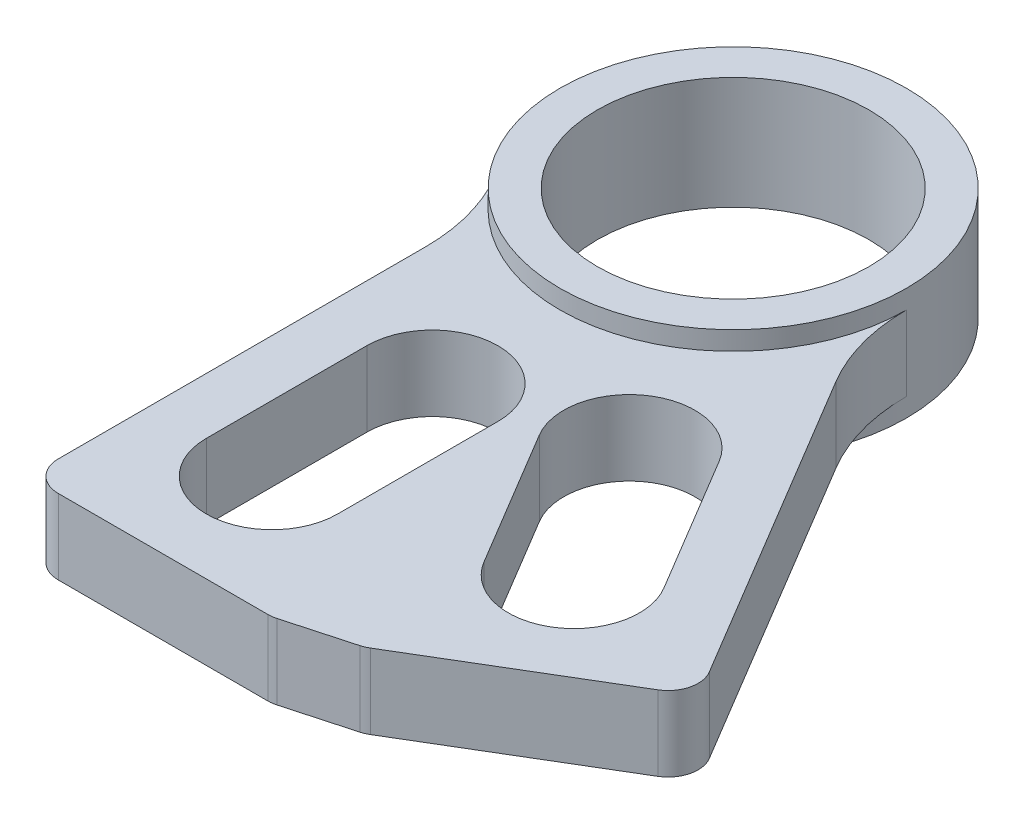
ISO-10303-21;
HEADER;
FILE_DESCRIPTION(('STEP AP214'),'2;1');
FILE_NAME('part.step','',(''),(''),'','','');
FILE_SCHEMA(('AUTOMOTIVE_DESIGN { 1 0 10303 214 1 1 1 1 }'));
ENDSEC;
DATA;
#1=APPLICATION_CONTEXT('core data for automotive mechanical design processes');
#2=APPLICATION_PROTOCOL_DEFINITION('international standard','automotive_design',2000,#1);
#3=PRODUCT_CONTEXT('',#1,'mechanical');
#4=PRODUCT('Part','Part','',(#3));
#5=PRODUCT_RELATED_PRODUCT_CATEGORY('part','',(#4));
#6=PRODUCT_DEFINITION_FORMATION('','',#4);
#7=PRODUCT_DEFINITION_CONTEXT('part definition',#1,'design');
#8=PRODUCT_DEFINITION('design','',#6,#7);
#9=PRODUCT_DEFINITION_SHAPE('','',#8);
#10=(LENGTH_UNIT() NAMED_UNIT(*) SI_UNIT(.MILLI.,.METRE.));
#11=(NAMED_UNIT(*) PLANE_ANGLE_UNIT() SI_UNIT($,.RADIAN.));
#12=(NAMED_UNIT(*) SI_UNIT($,.STERADIAN.) SOLID_ANGLE_UNIT());
#13=UNCERTAINTY_MEASURE_WITH_UNIT(LENGTH_MEASURE(1.E-05),#10,'distance_accuracy_value','');
#14=(GEOMETRIC_REPRESENTATION_CONTEXT(3) GLOBAL_UNCERTAINTY_ASSIGNED_CONTEXT((#13)) GLOBAL_UNIT_ASSIGNED_CONTEXT((#10,
#11,#12)) REPRESENTATION_CONTEXT('',''));
#15=CARTESIAN_POINT('',(0.,0.,0.));
#16=DIRECTION('',(0.,0.,1.));
#17=DIRECTION('',(1.,0.,0.));
#18=AXIS2_PLACEMENT_3D('',#15,#16,#17);
#19=CARTESIAN_POINT('',(0.,4.7625,0.));
#20=DIRECTION('',(0.,-1.,0.));
#21=DIRECTION('',(0.,0.,-1.));
#22=AXIS2_PLACEMENT_3D('',#19,#20,#21);
#23=CYLINDRICAL_SURFACE('',#22,11.5062);
#24=CARTESIAN_POINT('',(0.,4.7625,0.));
#25=DIRECTION('',(0.,1.,0.));
#26=DIRECTION('',(0.,0.,1.));
#27=AXIS2_PLACEMENT_3D('',#24,#25,#26);
#28=CIRCLE('',#27,11.5062);
#29=CARTESIAN_POINT('',(0.,4.7625,-11.5062));
#30=VERTEX_POINT('',#29);
#31=EDGE_CURVE('E285',#30,#30,#28,.T.);
#32=CARTESIAN_POINT('',(0.,-4.7625,0.));
#33=DIRECTION('',(0.,1.,0.));
#34=DIRECTION('',(0.,0.,1.));
#35=AXIS2_PLACEMENT_3D('',#32,#33,#34);
#36=CIRCLE('',#35,11.5062);
#37=CARTESIAN_POINT('',(0.,-4.7625,-11.5062));
#38=VERTEX_POINT('',#37);
#39=EDGE_CURVE('E280',#38,#38,#36,.T.);
#40=CARTESIAN_POINT('',(0.,4.7625,-11.5062));
#41=CARTESIAN_POINT('',(0.,4.66328125,-11.5062));
#42=CARTESIAN_POINT('',(0.,4.5640625,-11.5062));
#43=CARTESIAN_POINT('',(0.,4.365625,-11.5062));
#44=CARTESIAN_POINT('',(0.,4.26640625,-11.5062));
#45=CARTESIAN_POINT('',(0.,4.06796875,-11.5062));
#46=CARTESIAN_POINT('',(0.,3.96875,-11.5062));
#47=CARTESIAN_POINT('',(0.,3.7703125,-11.5062));
#48=CARTESIAN_POINT('',(0.,3.67109375,-11.5062));
#49=CARTESIAN_POINT('',(0.,3.47265625,-11.5062));
#50=CARTESIAN_POINT('',(0.,3.3734375,-11.5062));
#51=CARTESIAN_POINT('',(0.,3.175,-11.5062));
#52=CARTESIAN_POINT('',(0.,3.07578125,-11.5062));
#53=CARTESIAN_POINT('',(0.,2.87734375,-11.5062));
#54=CARTESIAN_POINT('',(0.,2.778125,-11.5062));
#55=CARTESIAN_POINT('',(0.,2.5796875,-11.5062));
#56=CARTESIAN_POINT('',(0.,2.48046875,-11.5062));
#57=CARTESIAN_POINT('',(0.,2.28203125,-11.5062));
#58=CARTESIAN_POINT('',(0.,2.1828125,-11.5062));
#59=CARTESIAN_POINT('',(0.,1.984375,-11.5062));
#60=CARTESIAN_POINT('',(0.,1.88515625,-11.5062));
#61=CARTESIAN_POINT('',(0.,1.68671875,-11.5062));
#62=CARTESIAN_POINT('',(0.,1.5875,-11.5062));
#63=CARTESIAN_POINT('',(0.,1.3890625,-11.5062));
#64=CARTESIAN_POINT('',(0.,1.28984375,-11.5062));
#65=CARTESIAN_POINT('',(0.,1.09140625,-11.5062));
#66=CARTESIAN_POINT('',(0.,0.992187499999999,-11.5062));
#67=CARTESIAN_POINT('',(0.,0.79375,-11.5062));
#68=CARTESIAN_POINT('',(0.,0.69453125,-11.5062));
#69=CARTESIAN_POINT('',(0.,0.49609375,-11.5062));
#70=CARTESIAN_POINT('',(0.,0.396875,-11.5062));
#71=CARTESIAN_POINT('',(0.,0.1984375,-11.5062));
#72=CARTESIAN_POINT('',(0.,0.0992187500000001,-11.5062));
#73=CARTESIAN_POINT('',(0.,-0.0992187500000001,-11.5062));
#74=CARTESIAN_POINT('',(0.,-0.1984375,-11.5062));
#75=CARTESIAN_POINT('',(0.,-0.396875,-11.5062));
#76=CARTESIAN_POINT('',(0.,-0.49609375,-11.5062));
#77=CARTESIAN_POINT('',(0.,-0.69453125,-11.5062));
#78=CARTESIAN_POINT('',(0.,-0.793750000000001,-11.5062));
#79=CARTESIAN_POINT('',(0.,-0.992187500000001,-11.5062));
#80=CARTESIAN_POINT('',(0.,-1.09140625,-11.5062));
#81=CARTESIAN_POINT('',(0.,-1.28984375,-11.5062));
#82=CARTESIAN_POINT('',(0.,-1.3890625,-11.5062));
#83=CARTESIAN_POINT('',(0.,-1.5875,-11.5062));
#84=CARTESIAN_POINT('',(0.,-1.68671875,-11.5062));
#85=CARTESIAN_POINT('',(0.,-1.88515625,-11.5062));
#86=CARTESIAN_POINT('',(0.,-1.984375,-11.5062));
#87=CARTESIAN_POINT('',(0.,-2.1828125,-11.5062));
#88=CARTESIAN_POINT('',(0.,-2.28203125,-11.5062));
#89=CARTESIAN_POINT('',(0.,-2.48046875,-11.5062));
#90=CARTESIAN_POINT('',(0.,-2.5796875,-11.5062));
#91=CARTESIAN_POINT('',(0.,-2.778125,-11.5062));
#92=CARTESIAN_POINT('',(0.,-2.87734375,-11.5062));
#93=CARTESIAN_POINT('',(0.,-3.07578125,-11.5062));
#94=CARTESIAN_POINT('',(0.,-3.175,-11.5062));
#95=CARTESIAN_POINT('',(0.,-3.3734375,-11.5062));
#96=CARTESIAN_POINT('',(0.,-3.47265625,-11.5062));
#97=CARTESIAN_POINT('',(0.,-3.67109375,-11.5062));
#98=CARTESIAN_POINT('',(0.,-3.7703125,-11.5062));
#99=CARTESIAN_POINT('',(0.,-3.96875,-11.5062));
#100=CARTESIAN_POINT('',(0.,-4.06796875,-11.5062));
#101=CARTESIAN_POINT('',(0.,-4.26640625,-11.5062));
#102=CARTESIAN_POINT('',(0.,-4.365625,-11.5062));
#103=CARTESIAN_POINT('',(0.,-4.5640625,-11.5062));
#104=CARTESIAN_POINT('',(0.,-4.66328125,-11.5062));
#105=CARTESIAN_POINT('',(0.,-4.7625,-11.5062));
#106=B_SPLINE_CURVE_WITH_KNOTS('',3,(#40,#41,#42,#43,#44,#45,#46,#47,#48,#49,#50,#51,#52,#53,
#54,#55,#56,#57,#58,#59,#60,#61,#62,#63,#64,#65,#66,#67,#68,#69,#70,#71,#72,#73,#74,#75,#76,#77,
#78,#79,#80,#81,#82,#83,#84,#85,#86,#87,#88,#89,#90,#91,#92,#93,#94,#95,#96,#97,#98,#99,#100,
#101,#102,#103,#104,#105),.UNSPECIFIED.,.F.,.F.,(4,2,2,2,2,2,2,2,2,2,2,2,2,2,2,2,2,2,2,2,2,2,2,
2,2,2,2,2,2,2,2,2,4),(0.,0.29765625,0.5953125,0.892968750000001,1.190625,1.48828125,1.7859375,
2.08359375,2.38125,2.67890625,2.9765625,3.27421875,3.571875,3.86953125,4.1671875,4.46484375,
4.7625,5.06015625,5.3578125,5.65546875,5.953125,6.25078125,6.5484375,6.84609375,7.14375,
7.44140625,7.7390625,8.03671875,8.334375,8.63203125,8.9296875,9.22734375,9.525),.UNSPECIFIED.);
#107=EDGE_CURVE('BSEAM43',#30,#38,#106,.T.);
#108=ORIENTED_EDGE('',*,*,#31,.T.);
#109=ORIENTED_EDGE('',*,*,#39,.F.);
#110=ORIENTED_EDGE('',*,*,#107,.T.);
#111=ORIENTED_EDGE('',*,*,#107,.F.);
#112=EDGE_LOOP('',(#108,#110,#109,#111));
#113=FACE_BOUND('',#112,.T.);
#114=ADVANCED_FACE('F43',(#113),#23,.F.);
#115=CARTESIAN_POINT('',(0.,4.7625,0.));
#116=DIRECTION('',(0.,-1.,0.));
#117=DIRECTION('',(0.,0.,-1.));
#118=AXIS2_PLACEMENT_3D('',#115,#116,#117);
#119=CYLINDRICAL_SURFACE('',#118,14.6812);
#120=DIRECTION('',(0.,-1.,0.));
#121=VECTOR('',#120,1.);
#122=CARTESIAN_POINT('',(14.6811919059461,4.7625,0.015416250636803));
#123=LINE('',#122,#121);
#124=CARTESIAN_POINT('',(14.6811919059461,3.175,0.015416250636803));
#125=VERTEX_POINT('',#124);
#126=CARTESIAN_POINT('',(14.6811919059461,-3.175,0.015416250636803));
#127=VERTEX_POINT('',#126);
#128=EDGE_CURVE('E299',#125,#127,#123,.T.);
#129=ORIENTED_EDGE('',*,*,#128,.T.);
#130=CARTESIAN_POINT('',(0.,-3.175,0.));
#131=DIRECTION('',(0.,1.,0.));
#132=DIRECTION('',(0.,0.,1.));
#133=AXIS2_PLACEMENT_3D('',#130,#131,#132);
#134=CIRCLE('',#133,14.6812);
#135=CARTESIAN_POINT('',(-12.5938687913907,-3.175,7.54533646070437));
#136=VERTEX_POINT('',#135);
#137=EDGE_CURVE('E260',#136,#127,#134,.T.);
#138=ORIENTED_EDGE('',*,*,#137,.F.);
#139=DIRECTION('',(0.,-1.,0.));
#140=VECTOR('',#139,1.);
#141=CARTESIAN_POINT('',(-12.5938687913907,4.7625,7.54533646070436));
#142=LINE('',#141,#140);
#143=CARTESIAN_POINT('',(-12.5938687913907,3.175,7.54533646070437));
#144=VERTEX_POINT('',#143);
#145=EDGE_CURVE('E292',#136,#144,#142,.F.);
#146=ORIENTED_EDGE('',*,*,#145,.T.);
#147=CARTESIAN_POINT('',(0.,3.175,0.));
#148=DIRECTION('',(0.,1.,0.));
#149=DIRECTION('',(0.,0.,1.));
#150=AXIS2_PLACEMENT_3D('',#147,#148,#149);
#151=CIRCLE('',#150,14.6812);
#152=EDGE_CURVE('E224',#144,#125,#151,.T.);
#153=ORIENTED_EDGE('',*,*,#152,.T.);
#154=EDGE_LOOP('',(#129,#138,#146,#153));
#155=FACE_BOUND('',#154,.T.);
#156=CARTESIAN_POINT('',(0.,4.7625,0.));
#157=DIRECTION('',(0.,1.,0.));
#158=DIRECTION('',(0.,0.,1.));
#159=AXIS2_PLACEMENT_3D('',#156,#157,#158);
#160=CIRCLE('',#159,14.6812);
#161=CARTESIAN_POINT('',(0.,4.7625,14.6812));
#162=VERTEX_POINT('',#161);
#163=EDGE_CURVE('E288',#162,#162,#160,.T.);
#164=ORIENTED_EDGE('',*,*,#163,.F.);
#165=EDGE_LOOP('',(#164));
#166=FACE_BOUND('',#165,.T.);
#167=CARTESIAN_POINT('',(0.,-4.7625,0.));
#168=DIRECTION('',(0.,1.,0.));
#169=DIRECTION('',(0.,0.,1.));
#170=AXIS2_PLACEMENT_3D('',#167,#168,#169);
#171=CIRCLE('',#170,14.6812);
#172=CARTESIAN_POINT('',(0.,-4.7625,14.6812));
#173=VERTEX_POINT('',#172);
#174=EDGE_CURVE('E289',#173,#173,#171,.T.);
#175=ORIENTED_EDGE('',*,*,#174,.T.);
#176=EDGE_LOOP('',(#175));
#177=FACE_BOUND('',#176,.T.);
#178=ADVANCED_FACE('F377',(#155,#166,#177),#119,.T.);
#179=CARTESIAN_POINT('',(0.,4.7625,0.));
#180=DIRECTION('',(0.,1.,0.));
#181=DIRECTION('',(0.,0.,1.));
#182=AXIS2_PLACEMENT_3D('',#179,#180,#181);
#183=PLANE('',#182);
#184=ORIENTED_EDGE('',*,*,#31,.F.);
#185=EDGE_LOOP('',(#184));
#186=FACE_BOUND('',#185,.T.);
#187=ORIENTED_EDGE('',*,*,#163,.T.);
#188=EDGE_LOOP('',(#187));
#189=FACE_BOUND('',#188,.T.);
#190=ADVANCED_FACE('F411',(#186,#189),#183,.T.);
#191=CARTESIAN_POINT('',(0.,-4.7625,0.));
#192=DIRECTION('',(0.,1.,0.));
#193=DIRECTION('',(0.,0.,1.));
#194=AXIS2_PLACEMENT_3D('',#191,#192,#193);
#195=PLANE('',#194);
#196=ORIENTED_EDGE('',*,*,#39,.T.);
#197=EDGE_LOOP('',(#196));
#198=FACE_BOUND('',#197,.T.);
#199=ORIENTED_EDGE('',*,*,#174,.F.);
#200=EDGE_LOOP('',(#199));
#201=FACE_BOUND('',#200,.T.);
#202=ADVANCED_FACE('F573',(#198,#201),#195,.F.);
#203=CARTESIAN_POINT('',(-10.31875,3.175,0.));
#204=DIRECTION('',(-1.,0.,0.));
#205=DIRECTION('',(0.,0.,1.));
#206=AXIS2_PLACEMENT_3D('',#203,#204,#205);
#207=PLANE('',#206);
#208=DIRECTION('',(0.,0.,-1.));
#209=VECTOR('',#208,1.);
#210=CARTESIAN_POINT('',(-10.31875,-3.175,0.));
#211=LINE('',#210,#209);
#212=CARTESIAN_POINT('',(-10.31875,-3.175,46.8503));
#213=VERTEX_POINT('',#212);
#214=CARTESIAN_POINT('',(-10.31875,-3.175,15.7694921185655));
#215=VERTEX_POINT('',#214);
#216=EDGE_CURVE('E262',#213,#215,#211,.T.);
#217=ORIENTED_EDGE('',*,*,#216,.F.);
#218=DIRECTION('',(0.,-1.,0.));
#219=VECTOR('',#218,1.);
#220=CARTESIAN_POINT('',(-10.31875,3.175,46.8503));
#221=LINE('',#220,#219);
#222=CARTESIAN_POINT('',(-10.31875,3.175,46.8503));
#223=VERTEX_POINT('',#222);
#224=EDGE_CURVE('E333',#213,#223,#221,.F.);
#225=ORIENTED_EDGE('',*,*,#224,.T.);
#226=DIRECTION('',(0.,0.,-1.));
#227=VECTOR('',#226,1.);
#228=CARTESIAN_POINT('',(-10.31875,3.175,0.));
#229=LINE('',#228,#227);
#230=CARTESIAN_POINT('',(-10.31875,3.175,15.7694921185655));
#231=VERTEX_POINT('',#230);
#232=EDGE_CURVE('E226',#223,#231,#229,.T.);
#233=ORIENTED_EDGE('',*,*,#232,.T.);
#234=DIRECTION('',(0.,-1.,0.));
#235=VECTOR('',#234,1.);
#236=CARTESIAN_POINT('',(-10.31875,3.175,15.7694921185655));
#237=LINE('',#236,#235);
#238=EDGE_CURVE('E305',#231,#215,#237,.T.);
#239=ORIENTED_EDGE('',*,*,#238,.T.);
#240=EDGE_LOOP('',(#217,#225,#233,#239));
#241=FACE_BOUND('',#240,.T.);
#242=ADVANCED_FACE('F565',(#241),#207,.T.);
#243=CARTESIAN_POINT('',(0.,3.175,49.3903));
#244=DIRECTION('',(0.,0.,-1.));
#245=DIRECTION('',(-1.,0.,0.));
#246=AXIS2_PLACEMENT_3D('',#243,#244,#245);
#247=PLANE('',#246);
#248=DIRECTION('',(1.,0.,0.));
#249=VECTOR('',#248,1.);
#250=CARTESIAN_POINT('',(0.,3.175,49.3903));
#251=LINE('',#250,#249);
#252=CARTESIAN_POINT('',(-7.77874999999999,3.175,49.3903));
#253=VERTEX_POINT('',#252);
#254=CARTESIAN_POINT('',(9.97457427537823,3.175,49.3903));
#255=VERTEX_POINT('',#254);
#256=EDGE_CURVE('E228',#253,#255,#251,.T.);
#257=ORIENTED_EDGE('',*,*,#256,.F.);
#258=DIRECTION('',(0.,-1.,0.));
#259=VECTOR('',#258,1.);
#260=CARTESIAN_POINT('',(-7.77874999999999,-3.175,49.3903));
#261=LINE('',#260,#259);
#262=CARTESIAN_POINT('',(-7.77874999999999,-3.175,49.3903));
#263=VERTEX_POINT('',#262);
#264=EDGE_CURVE('E322',#253,#263,#261,.T.);
#265=ORIENTED_EDGE('',*,*,#264,.T.);
#266=DIRECTION('',(1.,0.,0.));
#267=VECTOR('',#266,1.);
#268=CARTESIAN_POINT('',(0.,-3.175,49.3903));
#269=LINE('',#268,#267);
#270=CARTESIAN_POINT('',(9.97457427537823,-3.175,49.3903));
#271=VERTEX_POINT('',#270);
#272=EDGE_CURVE('E264',#263,#271,#269,.T.);
#273=ORIENTED_EDGE('',*,*,#272,.T.);
#274=DIRECTION('',(0.,-1.,0.));
#275=VECTOR('',#274,1.);
#276=CARTESIAN_POINT('',(9.97457427537823,3.175,49.3903));
#277=LINE('',#276,#275);
#278=EDGE_CURVE('E320',#271,#255,#277,.F.);
#279=ORIENTED_EDGE('',*,*,#278,.T.);
#280=EDGE_LOOP('',(#257,#265,#273,#279));
#281=FACE_BOUND('',#280,.T.);
#282=ADVANCED_FACE('F393',(#281),#247,.F.);
#283=CARTESIAN_POINT('',(13.4004724476745,3.175,48.5395182401329));
#284=DIRECTION('',(-0.266118345679753,0.,-0.96394036438603));
#285=DIRECTION('',(-0.96394036438603,0.,0.266118345679753));
#286=AXIS2_PLACEMENT_3D('',#283,#284,#285);
#287=PLANE('',#286);
#288=DIRECTION('',(0.96394036438603,0.,-0.266118345679753));
#289=VECTOR('',#288,1.);
#290=CARTESIAN_POINT('',(13.4004724476745,-3.175,48.5395182401329));
#291=LINE('',#290,#289);
#292=CARTESIAN_POINT('',(10.6505148734048,-3.175,49.2987085255405));
#293=VERTEX_POINT('',#292);
#294=CARTESIAN_POINT('',(16.1504300219459,-3.175,47.7803279547248));
#295=VERTEX_POINT('',#294);
#296=EDGE_CURVE('E267',#293,#295,#291,.T.);
#297=ORIENTED_EDGE('',*,*,#296,.T.);
#298=DIRECTION('',(0.,-1.,0.));
#299=VECTOR('',#298,1.);
#300=CARTESIAN_POINT('',(16.1504300219459,3.175,47.7803279547248));
#301=LINE('',#300,#299);
#302=CARTESIAN_POINT('',(16.1504300219459,3.175,47.7803279547248));
#303=VERTEX_POINT('',#302);
#304=EDGE_CURVE('E51',#295,#303,#301,.F.);
#305=ORIENTED_EDGE('',*,*,#304,.T.);
#306=DIRECTION('',(0.96394036438603,0.,-0.266118345679753));
#307=VECTOR('',#306,1.);
#308=CARTESIAN_POINT('',(13.4004724476745,3.175,48.5395182401329));
#309=LINE('',#308,#307);
#310=CARTESIAN_POINT('',(10.6505148734048,3.175,49.2987085255405));
#311=VERTEX_POINT('',#310);
#312=EDGE_CURVE('E231',#311,#303,#309,.T.);
#313=ORIENTED_EDGE('',*,*,#312,.F.);
#314=DIRECTION('',(0.,-1.,0.));
#315=VECTOR('',#314,1.);
#316=CARTESIAN_POINT('',(10.6505148734048,3.175,49.2987085255405));
#317=LINE('',#316,#315);
#318=EDGE_CURVE('E346',#311,#293,#317,.T.);
#319=ORIENTED_EDGE('',*,*,#318,.T.);
#320=EDGE_LOOP('',(#297,#305,#313,#319));
#321=FACE_BOUND('',#320,.T.);
#322=ADVANCED_FACE('F351',(#321),#287,.F.);
#323=CARTESIAN_POINT('',(25.3394183213385,3.175,42.3947592660486));
#324=DIRECTION('',(-0.513044430208735,0.,-0.85836205218532));
#325=DIRECTION('',(-0.85836205218532,0.,0.513044430208735));
#326=AXIS2_PLACEMENT_3D('',#323,#324,#325);
#327=PLANE('',#326);
#328=DIRECTION('',(0.85836205218532,0.,-0.513044430208735));
#329=VECTOR('',#328,1.);
#330=CARTESIAN_POINT('',(25.3394183213385,3.175,42.3947592660486));
#331=LINE('',#330,#329);
#332=CARTESIAN_POINT('',(16.7776222766495,3.175,47.512159041735));
#333=VERTEX_POINT('',#332);
#334=CARTESIAN_POINT('',(32.0164021347746,3.175,38.4039149045627));
#335=VERTEX_POINT('',#334);
#336=EDGE_CURVE('E234',#333,#335,#331,.T.);
#337=ORIENTED_EDGE('',*,*,#336,.F.);
#338=DIRECTION('',(0.,-1.,0.));
#339=VECTOR('',#338,1.);
#340=CARTESIAN_POINT('',(16.7776222766495,3.175,47.512159041735));
#341=LINE('',#340,#339);
#342=CARTESIAN_POINT('',(16.7776222766495,-3.175,47.512159041735));
#343=VERTEX_POINT('',#342);
#344=EDGE_CURVE('E343',#333,#343,#341,.T.);
#345=ORIENTED_EDGE('',*,*,#344,.T.);
#346=DIRECTION('',(0.85836205218532,0.,-0.513044430208735));
#347=VECTOR('',#346,1.);
#348=CARTESIAN_POINT('',(25.3394183213385,-3.175,42.3947592660486));
#349=LINE('',#348,#347);
#350=CARTESIAN_POINT('',(32.0164021347746,-3.175,38.4039149045627));
#351=VERTEX_POINT('',#350);
#352=EDGE_CURVE('E270',#343,#351,#349,.T.);
#353=ORIENTED_EDGE('',*,*,#352,.T.);
#354=DIRECTION('',(0.,-1.,0.));
#355=VECTOR('',#354,1.);
#356=CARTESIAN_POINT('',(32.0164021347746,3.175,38.4039149045627));
#357=LINE('',#356,#355);
#358=EDGE_CURVE('E66',#351,#335,#357,.F.);
#359=ORIENTED_EDGE('',*,*,#358,.T.);
#360=EDGE_LOOP('',(#337,#345,#353,#359));
#361=FACE_BOUND('',#360,.T.);
#362=ADVANCED_FACE('F361',(#361),#327,.F.);
#363=CARTESIAN_POINT('',(0.,3.175,25.48255));
#364=DIRECTION('',(0.,-1.,0.));
#365=DIRECTION('',(0.,0.,-1.));
#366=AXIS2_PLACEMENT_3D('',#363,#364,#365);
#367=CYLINDRICAL_SURFACE('',#366,5.55625);
#368=CARTESIAN_POINT('',(0.,-3.175,25.48255));
#369=DIRECTION('',(0.,1.,0.));
#370=DIRECTION('',(0.,0.,1.));
#371=AXIS2_PLACEMENT_3D('',#368,#369,#370);
#372=CIRCLE('',#371,5.55625);
#373=CARTESIAN_POINT('',(5.55625,-3.175,25.48255));
#374=VERTEX_POINT('',#373);
#375=CARTESIAN_POINT('',(-5.55624999999999,-3.175,25.48255));
#376=VERTEX_POINT('',#375);
#377=EDGE_CURVE('E248',#374,#376,#372,.T.);
#378=ORIENTED_EDGE('',*,*,#377,.F.);
#379=DIRECTION('',(0.,-1.,0.));
#380=VECTOR('',#379,1.);
#381=CARTESIAN_POINT('',(5.55625,3.175,25.48255));
#382=LINE('',#381,#380);
#383=CARTESIAN_POINT('',(5.55625,3.175,25.48255));
#384=VERTEX_POINT('',#383);
#385=EDGE_CURVE('E278',#384,#374,#382,.T.);
#386=ORIENTED_EDGE('',*,*,#385,.F.);
#387=CARTESIAN_POINT('',(0.,3.175,25.48255));
#388=DIRECTION('',(0.,1.,0.));
#389=DIRECTION('',(0.,0.,1.));
#390=AXIS2_PLACEMENT_3D('',#387,#388,#389);
#391=CIRCLE('',#390,5.55625);
#392=CARTESIAN_POINT('',(-5.55624999999999,3.175,25.48255));
#393=VERTEX_POINT('',#392);
#394=EDGE_CURVE('E213',#384,#393,#391,.T.);
#395=ORIENTED_EDGE('',*,*,#394,.T.);
#396=DIRECTION('',(0.,-1.,0.));
#397=VECTOR('',#396,1.);
#398=CARTESIAN_POINT('',(-5.55624999999999,3.175,25.48255));
#399=LINE('',#398,#397);
#400=EDGE_CURVE('E192',#393,#376,#399,.T.);
#401=ORIENTED_EDGE('',*,*,#400,.T.);
#402=EDGE_LOOP('',(#378,#386,#395,#401));
#403=FACE_BOUND('',#402,.T.);
#404=ADVANCED_FACE('F534',(#403),#367,.F.);
#405=CARTESIAN_POINT('',(5.55625,3.175,0.));
#406=DIRECTION('',(-1.,0.,0.));
#407=DIRECTION('',(0.,0.,1.));
#408=AXIS2_PLACEMENT_3D('',#405,#406,#407);
#409=PLANE('',#408);
#410=DIRECTION('',(0.,0.,-1.));
#411=VECTOR('',#410,1.);
#412=CARTESIAN_POINT('',(5.55625,-3.175,0.));
#413=LINE('',#412,#411);
#414=CARTESIAN_POINT('',(5.55625,-3.175,39.07155));
#415=VERTEX_POINT('',#414);
#416=EDGE_CURVE('E251',#415,#374,#413,.T.);
#417=ORIENTED_EDGE('',*,*,#416,.F.);
#418=DIRECTION('',(0.,-1.,0.));
#419=VECTOR('',#418,1.);
#420=CARTESIAN_POINT('',(5.55625,3.175,39.07155));
#421=LINE('',#420,#419);
#422=CARTESIAN_POINT('',(5.55625,3.175,39.07155));
#423=VERTEX_POINT('',#422);
#424=EDGE_CURVE('E276',#423,#415,#421,.T.);
#425=ORIENTED_EDGE('',*,*,#424,.F.);
#426=DIRECTION('',(0.,0.,-1.));
#427=VECTOR('',#426,1.);
#428=CARTESIAN_POINT('',(5.55625,3.175,0.));
#429=LINE('',#428,#427);
#430=EDGE_CURVE('E216',#423,#384,#429,.T.);
#431=ORIENTED_EDGE('',*,*,#430,.T.);
#432=ORIENTED_EDGE('',*,*,#385,.T.);
#433=EDGE_LOOP('',(#417,#425,#431,#432));
#434=FACE_BOUND('',#433,.T.);
#435=ADVANCED_FACE('F525',(#434),#409,.T.);
#436=CARTESIAN_POINT('',(0.,3.175,39.07155));
#437=DIRECTION('',(0.,-1.,0.));
#438=DIRECTION('',(0.,0.,-1.));
#439=AXIS2_PLACEMENT_3D('',#436,#437,#438);
#440=CYLINDRICAL_SURFACE('',#439,5.55625);
#441=CARTESIAN_POINT('',(0.,-3.175,39.07155));
#442=DIRECTION('',(0.,1.,0.));
#443=DIRECTION('',(0.,0.,1.));
#444=AXIS2_PLACEMENT_3D('',#441,#442,#443);
#445=CIRCLE('',#444,5.55625);
#446=CARTESIAN_POINT('',(-5.55625,-3.175,39.07155));
#447=VERTEX_POINT('',#446);
#448=EDGE_CURVE('E254',#447,#415,#445,.T.);
#449=ORIENTED_EDGE('',*,*,#448,.F.);
#450=DIRECTION('',(0.,-1.,0.));
#451=VECTOR('',#450,1.);
#452=CARTESIAN_POINT('',(-5.55625,3.175,39.07155));
#453=LINE('',#452,#451);
#454=CARTESIAN_POINT('',(-5.55625,3.175,39.07155));
#455=VERTEX_POINT('',#454);
#456=EDGE_CURVE('E274',#455,#447,#453,.T.);
#457=ORIENTED_EDGE('',*,*,#456,.F.);
#458=CARTESIAN_POINT('',(0.,3.175,39.07155));
#459=DIRECTION('',(0.,1.,0.));
#460=DIRECTION('',(0.,0.,1.));
#461=AXIS2_PLACEMENT_3D('',#458,#459,#460);
#462=CIRCLE('',#461,5.55625);
#463=EDGE_CURVE('E219',#455,#423,#462,.T.);
#464=ORIENTED_EDGE('',*,*,#463,.T.);
#465=ORIENTED_EDGE('',*,*,#424,.T.);
#466=EDGE_LOOP('',(#449,#457,#464,#465));
#467=FACE_BOUND('',#466,.T.);
#468=ADVANCED_FACE('F517',(#467),#440,.F.);
#469=CARTESIAN_POINT('',(13.0736803450151,3.175,21.8732539129153));
#470=DIRECTION('',(0.,-1.,0.));
#471=DIRECTION('',(0.,0.,-1.));
#472=AXIS2_PLACEMENT_3D('',#469,#470,#471);
#473=CYLINDRICAL_SURFACE('',#472,5.55625);
#474=CARTESIAN_POINT('',(13.0736803450151,-3.175,21.8732539129153));
#475=DIRECTION('',(0.,1.,0.));
#476=DIRECTION('',(0.,0.,1.));
#477=AXIS2_PLACEMENT_3D('',#474,#475,#476);
#478=CIRCLE('',#477,5.55625);
#479=CARTESIAN_POINT('',(17.8429544974698,-3.175,19.022650797568));
#480=VERTEX_POINT('',#479);
#481=CARTESIAN_POINT('',(8.30440619256044,-3.175,24.7238570282626));
#482=VERTEX_POINT('',#481);
#483=EDGE_CURVE('E187',#480,#482,#478,.T.);
#484=ORIENTED_EDGE('',*,*,#483,.F.);
#485=DIRECTION('',(0.,-1.,0.));
#486=VECTOR('',#485,1.);
#487=CARTESIAN_POINT('',(17.8429544974698,3.175,19.022650797568));
#488=LINE('',#487,#486);
#489=CARTESIAN_POINT('',(17.8429544974698,3.175,19.022650797568));
#490=VERTEX_POINT('',#489);
#491=EDGE_CURVE('E182',#490,#480,#488,.T.);
#492=ORIENTED_EDGE('',*,*,#491,.F.);
#493=CARTESIAN_POINT('',(13.0736803450151,3.175,21.8732539129153));
#494=DIRECTION('',(0.,1.,0.));
#495=DIRECTION('',(0.,0.,1.));
#496=AXIS2_PLACEMENT_3D('',#493,#494,#495);
#497=CIRCLE('',#496,5.55625);
#498=CARTESIAN_POINT('',(8.30440619256044,3.175,24.7238570282626));
#499=VERTEX_POINT('',#498);
#500=EDGE_CURVE('E185',#490,#499,#497,.T.);
#501=ORIENTED_EDGE('',*,*,#500,.T.);
#502=DIRECTION('',(0.,-1.,0.));
#503=VECTOR('',#502,1.);
#504=CARTESIAN_POINT('',(8.30440619256044,3.175,24.7238570282626));
#505=LINE('',#504,#503);
#506=EDGE_CURVE('E238',#499,#482,#505,.T.);
#507=ORIENTED_EDGE('',*,*,#506,.T.);
#508=EDGE_LOOP('',(#484,#492,#501,#507));
#509=FACE_BOUND('',#508,.T.);
#510=ADVANCED_FACE('F184',(#509),#473,.F.);
#511=CARTESIAN_POINT('',(4.76927415245425,3.175,-2.85060311534702));
#512=DIRECTION('',(-0.858362052185321,0.,0.513044430208734));
#513=DIRECTION('',(0.513044430208734,0.,0.858362052185321));
#514=AXIS2_PLACEMENT_3D('',#511,#512,#513);
#515=PLANE('',#514);
#516=DIRECTION('',(-0.513044430208734,0.,-0.858362052185321));
#517=VECTOR('',#516,1.);
#518=CARTESIAN_POINT('',(4.76927415245425,-3.175,-2.85060311534702));
#519=LINE('',#518,#517);
#520=CARTESIAN_POINT('',(24.8147152595763,-3.175,30.6869327247143));
#521=VERTEX_POINT('',#520);
#522=EDGE_CURVE('E240',#521,#480,#519,.T.);
#523=ORIENTED_EDGE('',*,*,#522,.F.);
#524=DIRECTION('',(0.,-1.,0.));
#525=VECTOR('',#524,1.);
#526=CARTESIAN_POINT('',(24.8147152595763,3.175,30.6869327247143));
#527=LINE('',#526,#525);
#528=CARTESIAN_POINT('',(24.8147152595763,3.175,30.6869327247143));
#529=VERTEX_POINT('',#528);
#530=EDGE_CURVE('E193',#529,#521,#527,.T.);
#531=ORIENTED_EDGE('',*,*,#530,.F.);
#532=DIRECTION('',(-0.513044430208734,0.,-0.858362052185321));
#533=VECTOR('',#532,1.);
#534=CARTESIAN_POINT('',(4.76927415245425,3.175,-2.85060311534702));
#535=LINE('',#534,#533);
#536=EDGE_CURVE('E200',#529,#490,#535,.T.);
#537=ORIENTED_EDGE('',*,*,#536,.T.);
#538=ORIENTED_EDGE('',*,*,#491,.T.);
#539=EDGE_LOOP('',(#523,#531,#537,#538));
#540=FACE_BOUND('',#539,.T.);
#541=ADVANCED_FACE('F207',(#540),#515,.T.);
#542=CARTESIAN_POINT('',(20.0454411071216,3.175,33.5375358400616));
#543=DIRECTION('',(0.,-1.,0.));
#544=DIRECTION('',(0.,0.,-1.));
#545=AXIS2_PLACEMENT_3D('',#542,#543,#544);
#546=CYLINDRICAL_SURFACE('',#545,5.55624999999999);
#547=CARTESIAN_POINT('',(20.0454411071216,-3.175,33.5375358400616));
#548=DIRECTION('',(0.,1.,0.));
#549=DIRECTION('',(0.,0.,1.));
#550=AXIS2_PLACEMENT_3D('',#547,#548,#549);
#551=CIRCLE('',#550,5.55624999999999);
#552=CARTESIAN_POINT('',(15.2761669546669,-3.175,36.3881389554089));
#553=VERTEX_POINT('',#552);
#554=EDGE_CURVE('E242',#553,#521,#551,.T.);
#555=ORIENTED_EDGE('',*,*,#554,.F.);
#556=DIRECTION('',(0.,-1.,0.));
#557=VECTOR('',#556,1.);
#558=CARTESIAN_POINT('',(15.2761669546669,3.175,36.3881389554089));
#559=LINE('',#558,#557);
#560=CARTESIAN_POINT('',(15.2761669546669,3.175,36.3881389554089));
#561=VERTEX_POINT('',#560);
#562=EDGE_CURVE('E282',#561,#553,#559,.T.);
#563=ORIENTED_EDGE('',*,*,#562,.F.);
#564=CARTESIAN_POINT('',(20.0454411071216,3.175,33.5375358400616));
#565=DIRECTION('',(0.,1.,0.));
#566=DIRECTION('',(0.,0.,1.));
#567=AXIS2_PLACEMENT_3D('',#564,#565,#566);
#568=CIRCLE('',#567,5.55624999999999);
#569=EDGE_CURVE('E208',#561,#529,#568,.T.);
#570=ORIENTED_EDGE('',*,*,#569,.T.);
#571=ORIENTED_EDGE('',*,*,#530,.T.);
#572=EDGE_LOOP('',(#555,#563,#570,#571));
#573=FACE_BOUND('',#572,.T.);
#574=ADVANCED_FACE('F493',(#573),#546,.F.);
#575=CARTESIAN_POINT('',(-5.55624999999999,3.175,0.));
#576=DIRECTION('',(-1.,0.,0.));
#577=DIRECTION('',(0.,0.,1.));
#578=AXIS2_PLACEMENT_3D('',#575,#576,#577);
#579=PLANE('',#578);
#580=DIRECTION('',(0.,0.,-1.));
#581=VECTOR('',#580,1.);
#582=CARTESIAN_POINT('',(-5.55624999999999,-3.175,0.));
#583=LINE('',#582,#581);
#584=EDGE_CURVE('E257',#447,#376,#583,.T.);
#585=ORIENTED_EDGE('',*,*,#584,.T.);
#586=ORIENTED_EDGE('',*,*,#400,.F.);
#587=DIRECTION('',(0.,0.,-1.));
#588=VECTOR('',#587,1.);
#589=CARTESIAN_POINT('',(-5.55624999999999,3.175,0.));
#590=LINE('',#589,#588);
#591=EDGE_CURVE('E222',#455,#393,#590,.T.);
#592=ORIENTED_EDGE('',*,*,#591,.F.);
#593=ORIENTED_EDGE('',*,*,#456,.T.);
#594=EDGE_LOOP('',(#585,#586,#592,#593));
#595=FACE_BOUND('',#594,.T.);
#596=ADVANCED_FACE('F484',(#595),#579,.F.);
#597=CARTESIAN_POINT('',(-4.76927415245515,3.175,2.85060311534756));
#598=DIRECTION('',(-0.85836205218532,0.,0.513044430208735));
#599=DIRECTION('',(0.513044430208735,0.,0.85836205218532));
#600=AXIS2_PLACEMENT_3D('',#597,#598,#599);
#601=PLANE('',#600);
#602=DIRECTION('',(-0.513044430208735,0.,-0.85836205218532));
#603=VECTOR('',#602,1.);
#604=CARTESIAN_POINT('',(-4.76927415245515,-3.175,2.85060311534756));
#605=LINE('',#604,#603);
#606=EDGE_CURVE('E245',#553,#482,#605,.T.);
#607=ORIENTED_EDGE('',*,*,#606,.T.);
#608=ORIENTED_EDGE('',*,*,#506,.F.);
#609=DIRECTION('',(-0.513044430208735,0.,-0.85836205218532));
#610=VECTOR('',#609,1.);
#611=CARTESIAN_POINT('',(-4.76927415245515,3.175,2.85060311534756));
#612=LINE('',#611,#610);
#613=EDGE_CURVE('E203',#561,#499,#612,.T.);
#614=ORIENTED_EDGE('',*,*,#613,.F.);
#615=ORIENTED_EDGE('',*,*,#562,.T.);
#616=EDGE_LOOP('',(#607,#608,#614,#615));
#617=FACE_BOUND('',#616,.T.);
#618=ADVANCED_FACE('F476',(#617),#601,.F.);
#619=CARTESIAN_POINT('',(8.85722342598682,3.175,-5.29397721421611));
#620=DIRECTION('',(-0.85836205218532,0.,0.513044430208734));
#621=DIRECTION('',(0.513044430208735,0.,0.858362052185321));
#622=AXIS2_PLACEMENT_3D('',#619,#620,#621);
#623=PLANE('',#622);
#624=DIRECTION('',(-0.513044430208735,0.,-0.858362052185321));
#625=VECTOR('',#624,1.);
#626=CARTESIAN_POINT('',(8.85722342598682,3.175,-5.29397721421611));
#627=LINE('',#626,#625);
#628=CARTESIAN_POINT('',(32.8935088945951,3.175,34.9205424392818));
#629=VERTEX_POINT('',#628);
#630=CARTESIAN_POINT('',(16.9476735246379,3.175,8.24195640259681));
#631=VERTEX_POINT('',#630);
#632=EDGE_CURVE('E236',#629,#631,#627,.T.);
#633=ORIENTED_EDGE('',*,*,#632,.F.);
#634=DIRECTION('',(0.,-1.,0.));
#635=VECTOR('',#634,1.);
#636=CARTESIAN_POINT('',(32.8935088945951,3.175,34.9205424392818));
#637=LINE('',#636,#635);
#638=CARTESIAN_POINT('',(32.8935088945951,-3.175,34.9205424392818));
#639=VERTEX_POINT('',#638);
#640=EDGE_CURVE('E11',#629,#639,#637,.T.);
#641=ORIENTED_EDGE('',*,*,#640,.T.);
#642=DIRECTION('',(-0.513044430208735,0.,-0.858362052185321));
#643=VECTOR('',#642,1.);
#644=CARTESIAN_POINT('',(8.85722342598682,-3.175,-5.29397721421611));
#645=LINE('',#644,#643);
#646=CARTESIAN_POINT('',(16.9476735246379,-3.175,8.24195640259681));
#647=VERTEX_POINT('',#646);
#648=EDGE_CURVE('E205',#639,#647,#645,.T.);
#649=ORIENTED_EDGE('',*,*,#648,.T.);
#650=DIRECTION('',(0.,1.,0.));
#651=VECTOR('',#650,1.);
#652=CARTESIAN_POINT('',(16.9476735246379,3.175,8.2419564025968));
#653=LINE('',#652,#651);
#654=EDGE_CURVE('E302',#647,#631,#653,.T.);
#655=ORIENTED_EDGE('',*,*,#654,.T.);
#656=EDGE_LOOP('',(#633,#641,#649,#655));
#657=FACE_BOUND('',#656,.T.);
#658=ADVANCED_FACE('F369',(#657),#623,.F.);
#659=CARTESIAN_POINT('',(0.,3.175,0.));
#660=DIRECTION('',(0.,1.,0.));
#661=DIRECTION('',(0.,0.,1.));
#662=AXIS2_PLACEMENT_3D('',#659,#660,#661);
#663=PLANE('',#662);
#664=ORIENTED_EDGE('',*,*,#500,.F.);
#665=ORIENTED_EDGE('',*,*,#536,.F.);
#666=ORIENTED_EDGE('',*,*,#569,.F.);
#667=ORIENTED_EDGE('',*,*,#613,.T.);
#668=EDGE_LOOP('',(#664,#665,#666,#667));
#669=FACE_BOUND('',#668,.T.);
#670=ORIENTED_EDGE('',*,*,#394,.F.);
#671=ORIENTED_EDGE('',*,*,#430,.F.);
#672=ORIENTED_EDGE('',*,*,#463,.F.);
#673=ORIENTED_EDGE('',*,*,#591,.T.);
#674=EDGE_LOOP('',(#670,#671,#672,#673));
#675=FACE_BOUND('',#674,.T.);
#676=ORIENTED_EDGE('',*,*,#232,.F.);
#677=CARTESIAN_POINT('',(-7.77874999999999,3.175,46.8503));
#678=DIRECTION('',(0.,1.,0.));
#679=DIRECTION('',(0.,0.,1.));
#680=AXIS2_PLACEMENT_3D('',#677,#678,#679);
#681=CIRCLE('',#680,2.54);
#682=EDGE_CURVE('E340',#223,#253,#681,.T.);
#683=ORIENTED_EDGE('',*,*,#682,.T.);
#684=ORIENTED_EDGE('',*,*,#256,.T.);
#685=CARTESIAN_POINT('',(9.97457427537823,3.175,46.8503));
#686=DIRECTION('',(0.,1.,0.));
#687=DIRECTION('',(0.,0.,1.));
#688=AXIS2_PLACEMENT_3D('',#685,#686,#687);
#689=CIRCLE('',#688,2.54);
#690=EDGE_CURVE('E336',#255,#311,#689,.T.);
#691=ORIENTED_EDGE('',*,*,#690,.T.);
#692=ORIENTED_EDGE('',*,*,#312,.T.);
#693=CARTESIAN_POINT('',(15.4744894239193,3.175,45.3319194291843));
#694=DIRECTION('',(0.,1.,0.));
#695=DIRECTION('',(0.,0.,1.));
#696=AXIS2_PLACEMENT_3D('',#693,#694,#695);
#697=CIRCLE('',#696,2.54);
#698=EDGE_CURVE('E338',#303,#333,#697,.T.);
#699=ORIENTED_EDGE('',*,*,#698,.T.);
#700=ORIENTED_EDGE('',*,*,#336,.T.);
#701=CARTESIAN_POINT('',(30.7132692820444,3.175,36.223675292012));
#702=DIRECTION('',(0.,1.,0.));
#703=DIRECTION('',(0.,0.,1.));
#704=AXIS2_PLACEMENT_3D('',#701,#702,#703);
#705=CIRCLE('',#704,2.54);
#706=EDGE_CURVE('E58',#335,#629,#705,.T.);
#707=ORIENTED_EDGE('',*,*,#706,.T.);
#708=ORIENTED_EDGE('',*,*,#632,.T.);
#709=CARTESIAN_POINT('',(30.6831830837073,3.175,0.0322194303966402));
#710=DIRECTION('',(0.,1.,0.));
#711=DIRECTION('',(0.,0.,1.));
#712=AXIS2_PLACEMENT_3D('',#709,#710,#711);
#713=CIRCLE('',#712,16.002);
#714=EDGE_CURVE('E311',#631,#125,#713,.F.);
#715=ORIENTED_EDGE('',*,*,#714,.T.);
#716=ORIENTED_EDGE('',*,*,#152,.F.);
#717=CARTESIAN_POINT('',(-26.32075,3.175,15.7694921185655));
#718=DIRECTION('',(0.,1.,0.));
#719=DIRECTION('',(0.,0.,1.));
#720=AXIS2_PLACEMENT_3D('',#717,#718,#719);
#721=CIRCLE('',#720,16.002);
#722=EDGE_CURVE('E317',#144,#231,#721,.F.);
#723=ORIENTED_EDGE('',*,*,#722,.T.);
#724=EDGE_LOOP('',(#676,#683,#684,#691,#692,#699,#700,#707,#708,#715,#716,#723));
#725=FACE_BOUND('',#724,.T.);
#726=ADVANCED_FACE('F197',(#669,#675,#725),#663,.T.);
#727=CARTESIAN_POINT('',(0.,-3.175,0.));
#728=DIRECTION('',(0.,1.,0.));
#729=DIRECTION('',(0.,0.,1.));
#730=AXIS2_PLACEMENT_3D('',#727,#728,#729);
#731=PLANE('',#730);
#732=ORIENTED_EDGE('',*,*,#483,.T.);
#733=ORIENTED_EDGE('',*,*,#606,.F.);
#734=ORIENTED_EDGE('',*,*,#554,.T.);
#735=ORIENTED_EDGE('',*,*,#522,.T.);
#736=EDGE_LOOP('',(#732,#733,#734,#735));
#737=FACE_BOUND('',#736,.T.);
#738=ORIENTED_EDGE('',*,*,#377,.T.);
#739=ORIENTED_EDGE('',*,*,#584,.F.);
#740=ORIENTED_EDGE('',*,*,#448,.T.);
#741=ORIENTED_EDGE('',*,*,#416,.T.);
#742=EDGE_LOOP('',(#738,#739,#740,#741));
#743=FACE_BOUND('',#742,.T.);
#744=ORIENTED_EDGE('',*,*,#272,.F.);
#745=CARTESIAN_POINT('',(-7.77874999999999,-3.175,46.8503));
#746=DIRECTION('',(0.,1.,0.));
#747=DIRECTION('',(0.,0.,1.));
#748=AXIS2_PLACEMENT_3D('',#745,#746,#747);
#749=CIRCLE('',#748,2.54);
#750=EDGE_CURVE('E331',#263,#213,#749,.F.);
#751=ORIENTED_EDGE('',*,*,#750,.T.);
#752=ORIENTED_EDGE('',*,*,#216,.T.);
#753=CARTESIAN_POINT('',(-26.32075,-3.175,15.7694921185655));
#754=DIRECTION('',(0.,1.,0.));
#755=DIRECTION('',(0.,0.,1.));
#756=AXIS2_PLACEMENT_3D('',#753,#754,#755);
#757=CIRCLE('',#756,16.002);
#758=EDGE_CURVE('E314',#215,#136,#757,.T.);
#759=ORIENTED_EDGE('',*,*,#758,.T.);
#760=ORIENTED_EDGE('',*,*,#137,.T.);
#761=CARTESIAN_POINT('',(30.6831830837073,-3.175,0.0322194303966402));
#762=DIRECTION('',(0.,1.,0.));
#763=DIRECTION('',(0.,0.,1.));
#764=AXIS2_PLACEMENT_3D('',#761,#762,#763);
#765=CIRCLE('',#764,16.002);
#766=EDGE_CURVE('E308',#127,#647,#765,.T.);
#767=ORIENTED_EDGE('',*,*,#766,.T.);
#768=ORIENTED_EDGE('',*,*,#648,.F.);
#769=CARTESIAN_POINT('',(30.7132692820444,-3.175,36.223675292012));
#770=DIRECTION('',(0.,1.,0.));
#771=DIRECTION('',(0.,0.,1.));
#772=AXIS2_PLACEMENT_3D('',#769,#770,#771);
#773=CIRCLE('',#772,2.54);
#774=EDGE_CURVE('E325',#639,#351,#773,.F.);
#775=ORIENTED_EDGE('',*,*,#774,.T.);
#776=ORIENTED_EDGE('',*,*,#352,.F.);
#777=CARTESIAN_POINT('',(15.4744894239193,-3.175,45.3319194291843));
#778=DIRECTION('',(0.,1.,0.));
#779=DIRECTION('',(0.,0.,1.));
#780=AXIS2_PLACEMENT_3D('',#777,#778,#779);
#781=CIRCLE('',#780,2.54);
#782=EDGE_CURVE('E329',#343,#295,#781,.F.);
#783=ORIENTED_EDGE('',*,*,#782,.T.);
#784=ORIENTED_EDGE('',*,*,#296,.F.);
#785=CARTESIAN_POINT('',(9.97457427537823,-3.175,46.8503));
#786=DIRECTION('',(0.,1.,0.));
#787=DIRECTION('',(0.,0.,1.));
#788=AXIS2_PLACEMENT_3D('',#785,#786,#787);
#789=CIRCLE('',#788,2.54);
#790=EDGE_CURVE('E327',#293,#271,#789,.F.);
#791=ORIENTED_EDGE('',*,*,#790,.T.);
#792=EDGE_LOOP('',(#744,#751,#752,#759,#760,#767,#768,#775,#776,#783,#784,#791));
#793=FACE_BOUND('',#792,.T.);
#794=ADVANCED_FACE('F364',(#737,#743,#793),#731,.F.);
#795=CARTESIAN_POINT('',(30.6831830837073,4.7625,0.0322194303966402));
#796=DIRECTION('',(0.,-1.,0.));
#797=DIRECTION('',(0.,0.,-1.));
#798=AXIS2_PLACEMENT_3D('',#795,#796,#797);
#799=CYLINDRICAL_SURFACE('',#798,16.002);
#800=ORIENTED_EDGE('',*,*,#714,.F.);
#801=ORIENTED_EDGE('',*,*,#654,.F.);
#802=ORIENTED_EDGE('',*,*,#766,.F.);
#803=ORIENTED_EDGE('',*,*,#128,.F.);
#804=EDGE_LOOP('',(#800,#801,#802,#803));
#805=FACE_BOUND('',#804,.T.);
#806=ADVANCED_FACE('F375',(#805),#799,.F.);
#807=CARTESIAN_POINT('',(-26.32075,4.7625,15.7694921185655));
#808=DIRECTION('',(0.,-1.,0.));
#809=DIRECTION('',(0.,0.,-1.));
#810=AXIS2_PLACEMENT_3D('',#807,#808,#809);
#811=CYLINDRICAL_SURFACE('',#810,16.002);
#812=ORIENTED_EDGE('',*,*,#722,.F.);
#813=ORIENTED_EDGE('',*,*,#145,.F.);
#814=ORIENTED_EDGE('',*,*,#758,.F.);
#815=ORIENTED_EDGE('',*,*,#238,.F.);
#816=EDGE_LOOP('',(#812,#813,#814,#815));
#817=FACE_BOUND('',#816,.T.);
#818=ADVANCED_FACE('F384',(#817),#811,.F.);
#819=CARTESIAN_POINT('',(-7.77874999999999,3.175,46.8503));
#820=DIRECTION('',(0.,1.,0.));
#821=DIRECTION('',(0.,0.,1.));
#822=AXIS2_PLACEMENT_3D('',#819,#820,#821);
#823=CYLINDRICAL_SURFACE('',#822,2.54);
#824=ORIENTED_EDGE('',*,*,#682,.F.);
#825=ORIENTED_EDGE('',*,*,#224,.F.);
#826=ORIENTED_EDGE('',*,*,#750,.F.);
#827=ORIENTED_EDGE('',*,*,#264,.F.);
#828=EDGE_LOOP('',(#824,#825,#826,#827));
#829=FACE_BOUND('',#828,.T.);
#830=ADVANCED_FACE('F391',(#829),#823,.T.);
#831=CARTESIAN_POINT('',(15.4744894239193,3.175,45.3319194291843));
#832=DIRECTION('',(0.,-1.,0.));
#833=DIRECTION('',(0.,0.,-1.));
#834=AXIS2_PLACEMENT_3D('',#831,#832,#833);
#835=CYLINDRICAL_SURFACE('',#834,2.54);
#836=ORIENTED_EDGE('',*,*,#698,.F.);
#837=ORIENTED_EDGE('',*,*,#304,.F.);
#838=ORIENTED_EDGE('',*,*,#782,.F.);
#839=ORIENTED_EDGE('',*,*,#344,.F.);
#840=EDGE_LOOP('',(#836,#837,#838,#839));
#841=FACE_BOUND('',#840,.T.);
#842=ADVANCED_FACE('F359',(#841),#835,.T.);
#843=CARTESIAN_POINT('',(9.97457427537823,3.175,46.8503));
#844=DIRECTION('',(0.,-1.,0.));
#845=DIRECTION('',(0.,0.,-1.));
#846=AXIS2_PLACEMENT_3D('',#843,#844,#845);
#847=CYLINDRICAL_SURFACE('',#846,2.54);
#848=ORIENTED_EDGE('',*,*,#690,.F.);
#849=ORIENTED_EDGE('',*,*,#278,.F.);
#850=ORIENTED_EDGE('',*,*,#790,.F.);
#851=ORIENTED_EDGE('',*,*,#318,.F.);
#852=EDGE_LOOP('',(#848,#849,#850,#851));
#853=FACE_BOUND('',#852,.T.);
#854=ADVANCED_FACE('F397',(#853),#847,.T.);
#855=CARTESIAN_POINT('',(30.7132692820444,3.175,36.223675292012));
#856=DIRECTION('',(0.,-1.,0.));
#857=DIRECTION('',(0.,0.,-1.));
#858=AXIS2_PLACEMENT_3D('',#855,#856,#857);
#859=CYLINDRICAL_SURFACE('',#858,2.54);
#860=ORIENTED_EDGE('',*,*,#706,.F.);
#861=ORIENTED_EDGE('',*,*,#358,.F.);
#862=ORIENTED_EDGE('',*,*,#774,.F.);
#863=ORIENTED_EDGE('',*,*,#640,.F.);
#864=EDGE_LOOP('',(#860,#861,#862,#863));
#865=FACE_BOUND('',#864,.T.);
#866=ADVANCED_FACE('F45',(#865),#859,.T.);
#867=CLOSED_SHELL('',(#114,#178,#190,#202,#242,#282,#322,#362,#404,#435,#468,#510,#541,#574,
#596,#618,#658,#726,#794,#806,#818,#830,#842,#854,#866));
#868=MANIFOLD_SOLID_BREP('B2',#867);
#869=ADVANCED_BREP_SHAPE_REPRESENTATION('',(#18,#868),#14);
#870=SHAPE_DEFINITION_REPRESENTATION(#9,#869);
ENDSEC;
END-ISO-10303-21;
